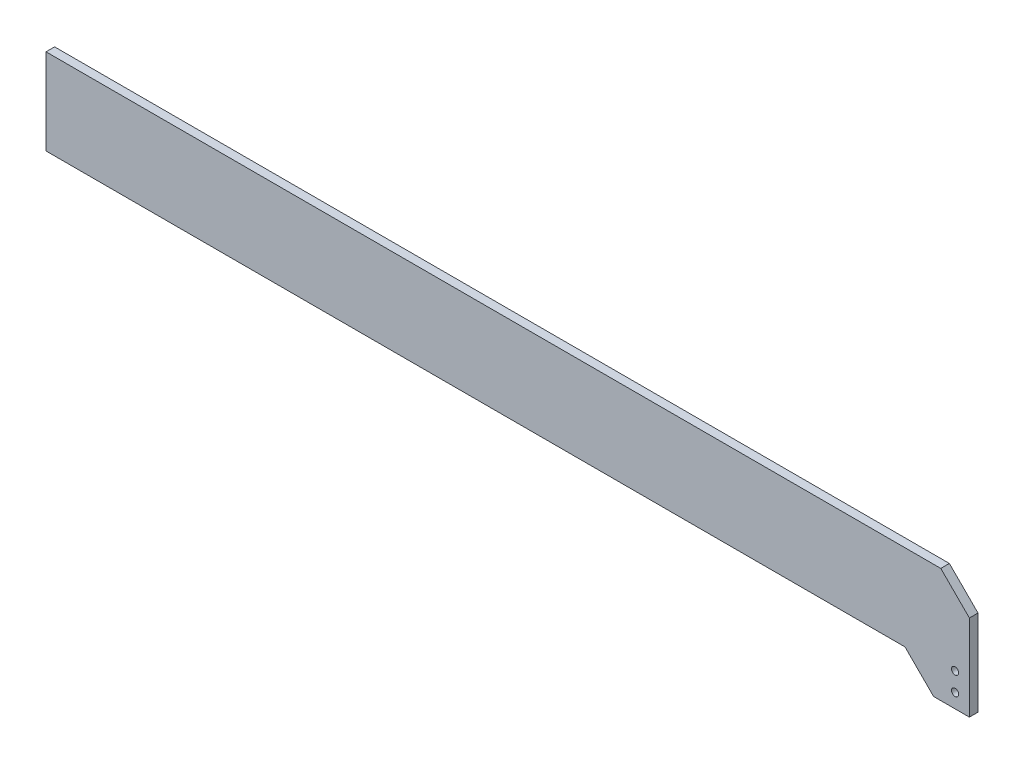
ISO-10303-21;
HEADER;
FILE_DESCRIPTION(('STEP AP214'),'2;1');
FILE_NAME('part.step','',(''),(''),'','','');
FILE_SCHEMA(('AUTOMOTIVE_DESIGN { 1 0 10303 214 1 1 1 1 }'));
ENDSEC;
DATA;
#1=APPLICATION_CONTEXT('core data for automotive mechanical design processes');
#2=APPLICATION_PROTOCOL_DEFINITION('international standard','automotive_design',2000,#1);
#3=PRODUCT_CONTEXT('',#1,'mechanical');
#4=PRODUCT('Part','Part','',(#3));
#5=PRODUCT_RELATED_PRODUCT_CATEGORY('part','',(#4));
#6=PRODUCT_DEFINITION_FORMATION('','',#4);
#7=PRODUCT_DEFINITION_CONTEXT('part definition',#1,'design');
#8=PRODUCT_DEFINITION('design','',#6,#7);
#9=PRODUCT_DEFINITION_SHAPE('','',#8);
#10=(LENGTH_UNIT() NAMED_UNIT(*) SI_UNIT(.MILLI.,.METRE.));
#11=(NAMED_UNIT(*) PLANE_ANGLE_UNIT() SI_UNIT($,.RADIAN.));
#12=(NAMED_UNIT(*) SI_UNIT($,.STERADIAN.) SOLID_ANGLE_UNIT());
#13=UNCERTAINTY_MEASURE_WITH_UNIT(LENGTH_MEASURE(1.E-05),#10,'distance_accuracy_value','');
#14=(GEOMETRIC_REPRESENTATION_CONTEXT(3) GLOBAL_UNCERTAINTY_ASSIGNED_CONTEXT((#13)) GLOBAL_UNIT_ASSIGNED_CONTEXT((#10,
#11,#12)) REPRESENTATION_CONTEXT('',''));
#15=CARTESIAN_POINT('',(0.,0.,0.));
#16=DIRECTION('',(0.,0.,1.));
#17=DIRECTION('',(1.,0.,0.));
#18=AXIS2_PLACEMENT_3D('',#15,#16,#17);
#19=CARTESIAN_POINT('',(0.,0.,6.));
#20=DIRECTION('',(0.,0.,1.));
#21=DIRECTION('',(1.,0.,0.));
#22=AXIS2_PLACEMENT_3D('',#19,#20,#21);
#23=PLANE('',#22);
#24=CARTESIAN_POINT('',(267.640643246163,105.769630368337,6.));
#25=DIRECTION('',(0.,0.,1.));
#26=DIRECTION('',(1.,0.,0.));
#27=AXIS2_PLACEMENT_3D('',#24,#25,#26);
#28=CIRCLE('',#27,2.50000000000002);
#29=CARTESIAN_POINT('',(270.140643246163,105.769630368337,6.));
#30=VERTEX_POINT('',#29);
#31=EDGE_CURVE('E140',#30,#30,#28,.T.);
#32=ORIENTED_EDGE('',*,*,#31,.F.);
#33=EDGE_LOOP('',(#32));
#34=FACE_BOUND('',#33,.T.);
#35=DIRECTION('',(0.,-1.,0.));
#36=VECTOR('',#35,1.);
#37=CARTESIAN_POINT('',(-367.359356753837,162.769630368337,6.));
#38=LINE('',#37,#36);
#39=CARTESIAN_POINT('',(-367.359356753837,162.769630368337,6.));
#40=VERTEX_POINT('',#39);
#41=CARTESIAN_POINT('',(-367.359356753837,102.769630368337,6.));
#42=VERTEX_POINT('',#41);
#43=EDGE_CURVE('E155',#40,#42,#38,.T.);
#44=ORIENTED_EDGE('',*,*,#43,.T.);
#45=DIRECTION('',(1.,0.,0.));
#46=VECTOR('',#45,1.);
#47=CARTESIAN_POINT('',(-367.359356753837,102.769630368337,6.));
#48=LINE('',#47,#46);
#49=CARTESIAN_POINT('',(232.640643246163,102.769630368337,6.));
#50=VERTEX_POINT('',#49);
#51=EDGE_CURVE('E97',#42,#50,#48,.T.);
#52=ORIENTED_EDGE('',*,*,#51,.T.);
#53=DIRECTION('',(0.707106781186543,-0.707106781186552,0.));
#54=VECTOR('',#53,1.);
#55=CARTESIAN_POINT('',(252.640643246163,82.7696303683374,6.));
#56=LINE('',#55,#54);
#57=CARTESIAN_POINT('',(252.640643246163,82.7696303683374,6.));
#58=VERTEX_POINT('',#57);
#59=EDGE_CURVE('E172',#50,#58,#56,.T.);
#60=ORIENTED_EDGE('',*,*,#59,.T.);
#61=DIRECTION('',(1.,0.,0.));
#62=VECTOR('',#61,1.);
#63=CARTESIAN_POINT('',(277.640643246163,82.7696303683374,6.));
#64=LINE('',#63,#62);
#65=CARTESIAN_POINT('',(277.640643246163,82.7696303683374,6.));
#66=VERTEX_POINT('',#65);
#67=EDGE_CURVE('E113',#58,#66,#64,.T.);
#68=ORIENTED_EDGE('',*,*,#67,.T.);
#69=DIRECTION('',(0.,1.,0.));
#70=VECTOR('',#69,1.);
#71=CARTESIAN_POINT('',(277.640643246163,142.769630368337,6.));
#72=LINE('',#71,#70);
#73=CARTESIAN_POINT('',(277.640643246163,142.769630368337,6.));
#74=VERTEX_POINT('',#73);
#75=EDGE_CURVE('E107',#66,#74,#72,.T.);
#76=ORIENTED_EDGE('',*,*,#75,.T.);
#77=DIRECTION('',(-0.707106781186544,0.707106781186551,0.));
#78=VECTOR('',#77,1.);
#79=CARTESIAN_POINT('',(257.640643246163,162.769630368337,6.));
#80=LINE('',#79,#78);
#81=CARTESIAN_POINT('',(257.640643246163,162.769630368337,6.));
#82=VERTEX_POINT('',#81);
#83=EDGE_CURVE('E111',#74,#82,#80,.T.);
#84=ORIENTED_EDGE('',*,*,#83,.T.);
#85=DIRECTION('',(-1.,0.,0.));
#86=VECTOR('',#85,1.);
#87=CARTESIAN_POINT('',(-367.359356753837,162.769630368337,6.));
#88=LINE('',#87,#86);
#89=EDGE_CURVE('E57',#82,#40,#88,.T.);
#90=ORIENTED_EDGE('',*,*,#89,.T.);
#91=EDGE_LOOP('',(#44,#52,#60,#68,#76,#84,#90));
#92=FACE_BOUND('',#91,.T.);
#93=CARTESIAN_POINT('',(267.640643246163,92.7696303683374,6.));
#94=DIRECTION('',(0.,0.,1.));
#95=DIRECTION('',(1.,0.,0.));
#96=AXIS2_PLACEMENT_3D('',#93,#94,#95);
#97=CIRCLE('',#96,2.50000000000002);
#98=CARTESIAN_POINT('',(270.140643246163,92.7696303683374,6.));
#99=VERTEX_POINT('',#98);
#100=EDGE_CURVE('E192',#99,#99,#97,.T.);
#101=ORIENTED_EDGE('',*,*,#100,.F.);
#102=EDGE_LOOP('',(#101));
#103=FACE_BOUND('',#102,.T.);
#104=ADVANCED_FACE('F39',(#34,#92,#103),#23,.T.);
#105=CARTESIAN_POINT('',(0.,0.,0.));
#106=DIRECTION('',(0.,0.,1.));
#107=DIRECTION('',(1.,0.,0.));
#108=AXIS2_PLACEMENT_3D('',#105,#106,#107);
#109=PLANE('',#108);
#110=DIRECTION('',(0.,-1.,0.));
#111=VECTOR('',#110,1.);
#112=CARTESIAN_POINT('',(-367.359356753837,162.769630368337,0.));
#113=LINE('',#112,#111);
#114=CARTESIAN_POINT('',(-367.359356753837,162.769630368337,0.));
#115=VERTEX_POINT('',#114);
#116=CARTESIAN_POINT('',(-367.359356753837,102.769630368337,0.));
#117=VERTEX_POINT('',#116);
#118=EDGE_CURVE('E135',#115,#117,#113,.T.);
#119=ORIENTED_EDGE('',*,*,#118,.F.);
#120=DIRECTION('',(-1.,0.,0.));
#121=VECTOR('',#120,1.);
#122=CARTESIAN_POINT('',(-367.359356753837,162.769630368337,0.));
#123=LINE('',#122,#121);
#124=CARTESIAN_POINT('',(257.640643246163,162.769630368337,0.));
#125=VERTEX_POINT('',#124);
#126=EDGE_CURVE('E89',#125,#115,#123,.T.);
#127=ORIENTED_EDGE('',*,*,#126,.F.);
#128=DIRECTION('',(-0.707106781186544,0.707106781186551,0.));
#129=VECTOR('',#128,1.);
#130=CARTESIAN_POINT('',(257.640643246163,162.769630368337,0.));
#131=LINE('',#130,#129);
#132=CARTESIAN_POINT('',(277.640643246163,142.769630368337,0.));
#133=VERTEX_POINT('',#132);
#134=EDGE_CURVE('E83',#133,#125,#131,.T.);
#135=ORIENTED_EDGE('',*,*,#134,.F.);
#136=DIRECTION('',(0.,1.,0.));
#137=VECTOR('',#136,1.);
#138=CARTESIAN_POINT('',(277.640643246163,142.769630368337,0.));
#139=LINE('',#138,#137);
#140=CARTESIAN_POINT('',(277.640643246163,82.7696303683374,0.));
#141=VERTEX_POINT('',#140);
#142=EDGE_CURVE('E122',#141,#133,#139,.T.);
#143=ORIENTED_EDGE('',*,*,#142,.F.);
#144=DIRECTION('',(1.,0.,0.));
#145=VECTOR('',#144,1.);
#146=CARTESIAN_POINT('',(277.640643246163,82.7696303683374,0.));
#147=LINE('',#146,#145);
#148=CARTESIAN_POINT('',(252.640643246163,82.7696303683374,0.));
#149=VERTEX_POINT('',#148);
#150=EDGE_CURVE('E146',#149,#141,#147,.T.);
#151=ORIENTED_EDGE('',*,*,#150,.F.);
#152=DIRECTION('',(0.707106781186543,-0.707106781186552,0.));
#153=VECTOR('',#152,1.);
#154=CARTESIAN_POINT('',(252.640643246163,82.7696303683374,0.));
#155=LINE('',#154,#153);
#156=CARTESIAN_POINT('',(232.640643246163,102.769630368337,0.));
#157=VERTEX_POINT('',#156);
#158=EDGE_CURVE('E143',#157,#149,#155,.T.);
#159=ORIENTED_EDGE('',*,*,#158,.F.);
#160=DIRECTION('',(1.,0.,0.));
#161=VECTOR('',#160,1.);
#162=CARTESIAN_POINT('',(-367.359356753837,102.769630368337,0.));
#163=LINE('',#162,#161);
#164=EDGE_CURVE('E139',#117,#157,#163,.T.);
#165=ORIENTED_EDGE('',*,*,#164,.F.);
#166=EDGE_LOOP('',(#119,#127,#135,#143,#151,#159,#165));
#167=FACE_BOUND('',#166,.T.);
#168=CARTESIAN_POINT('',(267.640643246163,105.769630368337,0.));
#169=DIRECTION('',(0.,0.,1.));
#170=DIRECTION('',(1.,0.,0.));
#171=AXIS2_PLACEMENT_3D('',#168,#169,#170);
#172=CIRCLE('',#171,2.50000000000002);
#173=CARTESIAN_POINT('',(270.140643246163,105.769630368337,0.));
#174=VERTEX_POINT('',#173);
#175=EDGE_CURVE('E188',#174,#174,#172,.T.);
#176=ORIENTED_EDGE('',*,*,#175,.T.);
#177=EDGE_LOOP('',(#176));
#178=FACE_BOUND('',#177,.T.);
#179=CARTESIAN_POINT('',(267.640643246163,92.7696303683374,0.));
#180=DIRECTION('',(0.,0.,1.));
#181=DIRECTION('',(1.,0.,0.));
#182=AXIS2_PLACEMENT_3D('',#179,#180,#181);
#183=CIRCLE('',#182,2.50000000000002);
#184=CARTESIAN_POINT('',(270.140643246163,92.7696303683374,0.));
#185=VERTEX_POINT('',#184);
#186=EDGE_CURVE('E196',#185,#185,#183,.T.);
#187=ORIENTED_EDGE('',*,*,#186,.T.);
#188=EDGE_LOOP('',(#187));
#189=FACE_BOUND('',#188,.T.);
#190=ADVANCED_FACE('F176',(#167,#178,#189),#109,.F.);
#191=CARTESIAN_POINT('',(-367.359356753837,162.769630368337,6.));
#192=DIRECTION('',(1.,0.,0.));
#193=DIRECTION('',(0.,0.,-1.));
#194=AXIS2_PLACEMENT_3D('',#191,#192,#193);
#195=PLANE('',#194);
#196=ORIENTED_EDGE('',*,*,#118,.T.);
#197=DIRECTION('',(0.,0.,-1.));
#198=VECTOR('',#197,1.);
#199=CARTESIAN_POINT('',(-367.359356753837,102.769630368337,6.));
#200=LINE('',#199,#198);
#201=EDGE_CURVE('E11',#42,#117,#200,.T.);
#202=ORIENTED_EDGE('',*,*,#201,.F.);
#203=ORIENTED_EDGE('',*,*,#43,.F.);
#204=DIRECTION('',(0.,0.,-1.));
#205=VECTOR('',#204,1.);
#206=CARTESIAN_POINT('',(-367.359356753837,162.769630368337,6.));
#207=LINE('',#206,#205);
#208=EDGE_CURVE('E131',#40,#115,#207,.T.);
#209=ORIENTED_EDGE('',*,*,#208,.T.);
#210=EDGE_LOOP('',(#196,#202,#203,#209));
#211=FACE_BOUND('',#210,.T.);
#212=ADVANCED_FACE('F41',(#211),#195,.F.);
#213=CARTESIAN_POINT('',(-367.359356753837,102.769630368337,6.));
#214=DIRECTION('',(0.,1.,0.));
#215=DIRECTION('',(0.,0.,1.));
#216=AXIS2_PLACEMENT_3D('',#213,#214,#215);
#217=PLANE('',#216);
#218=ORIENTED_EDGE('',*,*,#164,.T.);
#219=DIRECTION('',(0.,0.,-1.));
#220=VECTOR('',#219,1.);
#221=CARTESIAN_POINT('',(232.640643246163,102.769630368337,6.));
#222=LINE('',#221,#220);
#223=EDGE_CURVE('E49',#50,#157,#222,.T.);
#224=ORIENTED_EDGE('',*,*,#223,.F.);
#225=ORIENTED_EDGE('',*,*,#51,.F.);
#226=ORIENTED_EDGE('',*,*,#201,.T.);
#227=EDGE_LOOP('',(#218,#224,#225,#226));
#228=FACE_BOUND('',#227,.T.);
#229=ADVANCED_FACE('F228',(#228),#217,.F.);
#230=CARTESIAN_POINT('',(252.640643246163,82.7696303683374,6.));
#231=DIRECTION('',(0.707106781186552,0.707106781186543,0.));
#232=DIRECTION('',(-0.707106781186543,0.707106781186552,0.));
#233=AXIS2_PLACEMENT_3D('',#230,#231,#232);
#234=PLANE('',#233);
#235=ORIENTED_EDGE('',*,*,#158,.T.);
#236=DIRECTION('',(0.,0.,-1.));
#237=VECTOR('',#236,1.);
#238=CARTESIAN_POINT('',(252.640643246163,82.7696303683374,6.));
#239=LINE('',#238,#237);
#240=EDGE_CURVE('E162',#58,#149,#239,.T.);
#241=ORIENTED_EDGE('',*,*,#240,.F.);
#242=ORIENTED_EDGE('',*,*,#59,.F.);
#243=ORIENTED_EDGE('',*,*,#223,.T.);
#244=EDGE_LOOP('',(#235,#241,#242,#243));
#245=FACE_BOUND('',#244,.T.);
#246=ADVANCED_FACE('F170',(#245),#234,.F.);
#247=CARTESIAN_POINT('',(277.640643246163,82.7696303683374,6.));
#248=DIRECTION('',(0.,1.,0.));
#249=DIRECTION('',(-1.,0.,0.));
#250=AXIS2_PLACEMENT_3D('',#247,#248,#249);
#251=PLANE('',#250);
#252=ORIENTED_EDGE('',*,*,#150,.T.);
#253=DIRECTION('',(0.,0.,-1.));
#254=VECTOR('',#253,1.);
#255=CARTESIAN_POINT('',(277.640643246163,82.7696303683374,6.));
#256=LINE('',#255,#254);
#257=EDGE_CURVE('E124',#66,#141,#256,.T.);
#258=ORIENTED_EDGE('',*,*,#257,.F.);
#259=ORIENTED_EDGE('',*,*,#67,.F.);
#260=ORIENTED_EDGE('',*,*,#240,.T.);
#261=EDGE_LOOP('',(#252,#258,#259,#260));
#262=FACE_BOUND('',#261,.T.);
#263=ADVANCED_FACE('F179',(#262),#251,.F.);
#264=CARTESIAN_POINT('',(277.640643246163,142.769630368337,6.));
#265=DIRECTION('',(-1.,0.,0.));
#266=DIRECTION('',(0.,0.,1.));
#267=AXIS2_PLACEMENT_3D('',#264,#265,#266);
#268=PLANE('',#267);
#269=ORIENTED_EDGE('',*,*,#142,.T.);
#270=DIRECTION('',(0.,0.,-1.));
#271=VECTOR('',#270,1.);
#272=CARTESIAN_POINT('',(277.640643246163,142.769630368337,6.));
#273=LINE('',#272,#271);
#274=EDGE_CURVE('E119',#74,#133,#273,.T.);
#275=ORIENTED_EDGE('',*,*,#274,.F.);
#276=ORIENTED_EDGE('',*,*,#75,.F.);
#277=ORIENTED_EDGE('',*,*,#257,.T.);
#278=EDGE_LOOP('',(#269,#275,#276,#277));
#279=FACE_BOUND('',#278,.T.);
#280=ADVANCED_FACE('F120',(#279),#268,.F.);
#281=CARTESIAN_POINT('',(257.640643246163,162.769630368337,6.));
#282=DIRECTION('',(-0.707106781186551,-0.707106781186544,0.));
#283=DIRECTION('',(0.707106781186544,-0.707106781186551,0.));
#284=AXIS2_PLACEMENT_3D('',#281,#282,#283);
#285=PLANE('',#284);
#286=ORIENTED_EDGE('',*,*,#134,.T.);
#287=DIRECTION('',(0.,0.,-1.));
#288=VECTOR('',#287,1.);
#289=CARTESIAN_POINT('',(257.640643246163,162.769630368337,6.));
#290=LINE('',#289,#288);
#291=EDGE_CURVE('E125',#82,#125,#290,.T.);
#292=ORIENTED_EDGE('',*,*,#291,.F.);
#293=ORIENTED_EDGE('',*,*,#83,.F.);
#294=ORIENTED_EDGE('',*,*,#274,.T.);
#295=EDGE_LOOP('',(#286,#292,#293,#294));
#296=FACE_BOUND('',#295,.T.);
#297=ADVANCED_FACE('F127',(#296),#285,.F.);
#298=CARTESIAN_POINT('',(-367.359356753837,162.769630368337,6.));
#299=DIRECTION('',(0.,-1.,0.));
#300=DIRECTION('',(0.,0.,-1.));
#301=AXIS2_PLACEMENT_3D('',#298,#299,#300);
#302=PLANE('',#301);
#303=ORIENTED_EDGE('',*,*,#126,.T.);
#304=ORIENTED_EDGE('',*,*,#208,.F.);
#305=ORIENTED_EDGE('',*,*,#89,.F.);
#306=ORIENTED_EDGE('',*,*,#291,.T.);
#307=EDGE_LOOP('',(#303,#304,#305,#306));
#308=FACE_BOUND('',#307,.T.);
#309=ADVANCED_FACE('F218',(#308),#302,.F.);
#310=CARTESIAN_POINT('',(267.640643246163,105.769630368337,6.));
#311=DIRECTION('',(0.,0.,-1.));
#312=DIRECTION('',(-1.,0.,0.));
#313=AXIS2_PLACEMENT_3D('',#310,#311,#312);
#314=CYLINDRICAL_SURFACE('',#313,2.50000000000002);
#315=ORIENTED_EDGE('',*,*,#31,.T.);
#316=EDGE_LOOP('',(#315));
#317=FACE_BOUND('',#316,.T.);
#318=ORIENTED_EDGE('',*,*,#175,.F.);
#319=EDGE_LOOP('',(#318));
#320=FACE_BOUND('',#319,.T.);
#321=ADVANCED_FACE('F215',(#317,#320),#314,.F.);
#322=CARTESIAN_POINT('',(267.640643246163,92.7696303683374,6.));
#323=DIRECTION('',(0.,0.,-1.));
#324=DIRECTION('',(-1.,0.,0.));
#325=AXIS2_PLACEMENT_3D('',#322,#323,#324);
#326=CYLINDRICAL_SURFACE('',#325,2.50000000000002);
#327=ORIENTED_EDGE('',*,*,#100,.T.);
#328=EDGE_LOOP('',(#327));
#329=FACE_BOUND('',#328,.T.);
#330=ORIENTED_EDGE('',*,*,#186,.F.);
#331=EDGE_LOOP('',(#330));
#332=FACE_BOUND('',#331,.T.);
#333=ADVANCED_FACE('F204',(#329,#332),#326,.F.);
#334=CLOSED_SHELL('',(#104,#190,#212,#229,#246,#263,#280,#297,#309,#321,#333));
#335=MANIFOLD_SOLID_BREP('B2',#334);
#336=ADVANCED_BREP_SHAPE_REPRESENTATION('',(#18,#335),#14);
#337=SHAPE_DEFINITION_REPRESENTATION(#9,#336);
ENDSEC;
END-ISO-10303-21;
